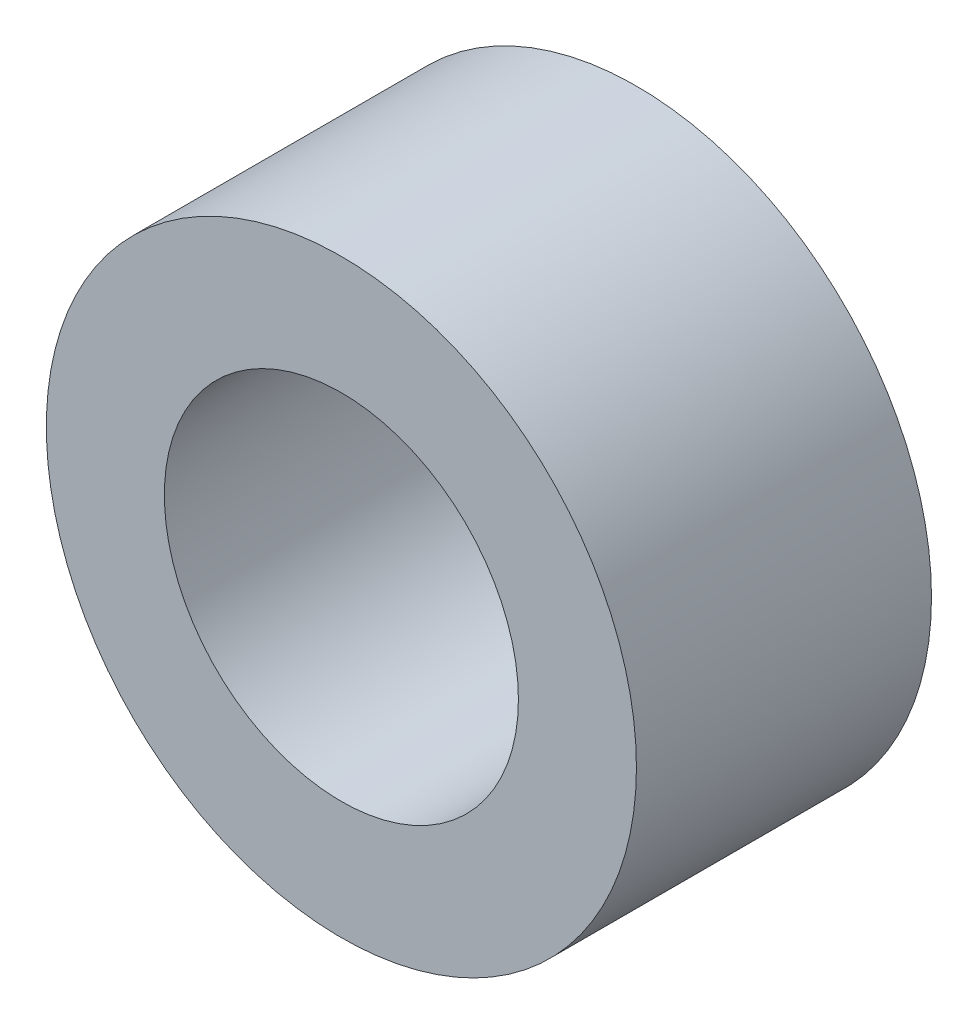
ISO-10303-21;
HEADER;
FILE_DESCRIPTION(('STEP AP214'),'2;1');
FILE_NAME('part.step','',(''),(''),'','','');
FILE_SCHEMA(('AUTOMOTIVE_DESIGN { 1 0 10303 214 1 1 1 1 }'));
ENDSEC;
DATA;
#1=APPLICATION_CONTEXT('core data for automotive mechanical design processes');
#2=APPLICATION_PROTOCOL_DEFINITION('international standard','automotive_design',2000,#1);
#3=PRODUCT_CONTEXT('',#1,'mechanical');
#4=PRODUCT('Part','Part','',(#3));
#5=PRODUCT_RELATED_PRODUCT_CATEGORY('part','',(#4));
#6=PRODUCT_DEFINITION_FORMATION('','',#4);
#7=PRODUCT_DEFINITION_CONTEXT('part definition',#1,'design');
#8=PRODUCT_DEFINITION('design','',#6,#7);
#9=PRODUCT_DEFINITION_SHAPE('','',#8);
#10=(LENGTH_UNIT() NAMED_UNIT(*) SI_UNIT(.MILLI.,.METRE.));
#11=(NAMED_UNIT(*) PLANE_ANGLE_UNIT() SI_UNIT($,.RADIAN.));
#12=(NAMED_UNIT(*) SI_UNIT($,.STERADIAN.) SOLID_ANGLE_UNIT());
#13=UNCERTAINTY_MEASURE_WITH_UNIT(LENGTH_MEASURE(1.E-05),#10,'distance_accuracy_value','');
#14=(GEOMETRIC_REPRESENTATION_CONTEXT(3) GLOBAL_UNCERTAINTY_ASSIGNED_CONTEXT((#13)) GLOBAL_UNIT_ASSIGNED_CONTEXT((#10,
#11,#12)) REPRESENTATION_CONTEXT('',''));
#15=CARTESIAN_POINT('',(0.,0.,0.));
#16=DIRECTION('',(0.,0.,1.));
#17=DIRECTION('',(1.,0.,0.));
#18=AXIS2_PLACEMENT_3D('',#15,#16,#17);
#19=CARTESIAN_POINT('',(0.,0.,5.));
#20=DIRECTION('',(0.,0.,1.));
#21=DIRECTION('',(1.,0.,0.));
#22=AXIS2_PLACEMENT_3D('',#19,#20,#21);
#23=PLANE('',#22);
#24=CARTESIAN_POINT('',(0.,0.,5.));
#25=DIRECTION('',(0.,0.,1.));
#26=DIRECTION('',(1.,0.,0.));
#27=AXIS2_PLACEMENT_3D('',#24,#25,#26);
#28=CIRCLE('',#27,5.);
#29=CARTESIAN_POINT('',(5.,0.,5.));
#30=VERTEX_POINT('',#29);
#31=EDGE_CURVE('E10',#30,#30,#28,.T.);
#32=ORIENTED_EDGE('',*,*,#31,.T.);
#33=EDGE_LOOP('',(#32));
#34=FACE_BOUND('',#33,.T.);
#35=CARTESIAN_POINT('',(0.,0.,5.));
#36=DIRECTION('',(0.,0.,1.));
#37=DIRECTION('',(1.,0.,0.));
#38=AXIS2_PLACEMENT_3D('',#35,#36,#37);
#39=CIRCLE('',#38,3.);
#40=CARTESIAN_POINT('',(3.,0.,5.));
#41=VERTEX_POINT('',#40);
#42=EDGE_CURVE('E42',#41,#41,#39,.T.);
#43=ORIENTED_EDGE('',*,*,#42,.F.);
#44=EDGE_LOOP('',(#43));
#45=FACE_BOUND('',#44,.T.);
#46=ADVANCED_FACE('F31',(#34,#45),#23,.T.);
#47=CARTESIAN_POINT('',(0.,0.,0.));
#48=DIRECTION('',(0.,0.,1.));
#49=DIRECTION('',(1.,0.,0.));
#50=AXIS2_PLACEMENT_3D('',#47,#48,#49);
#51=PLANE('',#50);
#52=CARTESIAN_POINT('',(0.,0.,0.));
#53=DIRECTION('',(0.,0.,1.));
#54=DIRECTION('',(1.,0.,0.));
#55=AXIS2_PLACEMENT_3D('',#52,#53,#54);
#56=CIRCLE('',#55,5.);
#57=CARTESIAN_POINT('',(5.,0.,0.));
#58=VERTEX_POINT('',#57);
#59=EDGE_CURVE('E35',#58,#58,#56,.T.);
#60=ORIENTED_EDGE('',*,*,#59,.F.);
#61=EDGE_LOOP('',(#60));
#62=FACE_BOUND('',#61,.T.);
#63=CARTESIAN_POINT('',(0.,0.,0.));
#64=DIRECTION('',(0.,0.,1.));
#65=DIRECTION('',(1.,0.,0.));
#66=AXIS2_PLACEMENT_3D('',#63,#64,#65);
#67=CIRCLE('',#66,3.);
#68=CARTESIAN_POINT('',(3.,0.,0.));
#69=VERTEX_POINT('',#68);
#70=EDGE_CURVE('E44',#69,#69,#67,.T.);
#71=ORIENTED_EDGE('',*,*,#70,.T.);
#72=EDGE_LOOP('',(#71));
#73=FACE_BOUND('',#72,.T.);
#74=ADVANCED_FACE('F54',(#62,#73),#51,.F.);
#75=CARTESIAN_POINT('',(0.,0.,5.));
#76=DIRECTION('',(0.,0.,-1.));
#77=DIRECTION('',(-1.,0.,0.));
#78=AXIS2_PLACEMENT_3D('',#75,#76,#77);
#79=CYLINDRICAL_SURFACE('',#78,5.);
#80=ORIENTED_EDGE('',*,*,#31,.F.);
#81=EDGE_LOOP('',(#80));
#82=FACE_BOUND('',#81,.T.);
#83=ORIENTED_EDGE('',*,*,#59,.T.);
#84=EDGE_LOOP('',(#83));
#85=FACE_BOUND('',#84,.T.);
#86=ADVANCED_FACE('F33',(#82,#85),#79,.T.);
#87=CARTESIAN_POINT('',(0.,0.,5.));
#88=DIRECTION('',(0.,0.,-1.));
#89=DIRECTION('',(-1.,0.,0.));
#90=AXIS2_PLACEMENT_3D('',#87,#88,#89);
#91=CYLINDRICAL_SURFACE('',#90,3.);
#92=ORIENTED_EDGE('',*,*,#42,.T.);
#93=EDGE_LOOP('',(#92));
#94=FACE_BOUND('',#93,.T.);
#95=ORIENTED_EDGE('',*,*,#70,.F.);
#96=EDGE_LOOP('',(#95));
#97=FACE_BOUND('',#96,.T.);
#98=ADVANCED_FACE('F50',(#94,#97),#91,.F.);
#99=CLOSED_SHELL('',(#46,#74,#86,#98));
#100=MANIFOLD_SOLID_BREP('B2',#99);
#101=ADVANCED_BREP_SHAPE_REPRESENTATION('',(#18,#100),#14);
#102=SHAPE_DEFINITION_REPRESENTATION(#9,#101);
ENDSEC;
END-ISO-10303-21;
